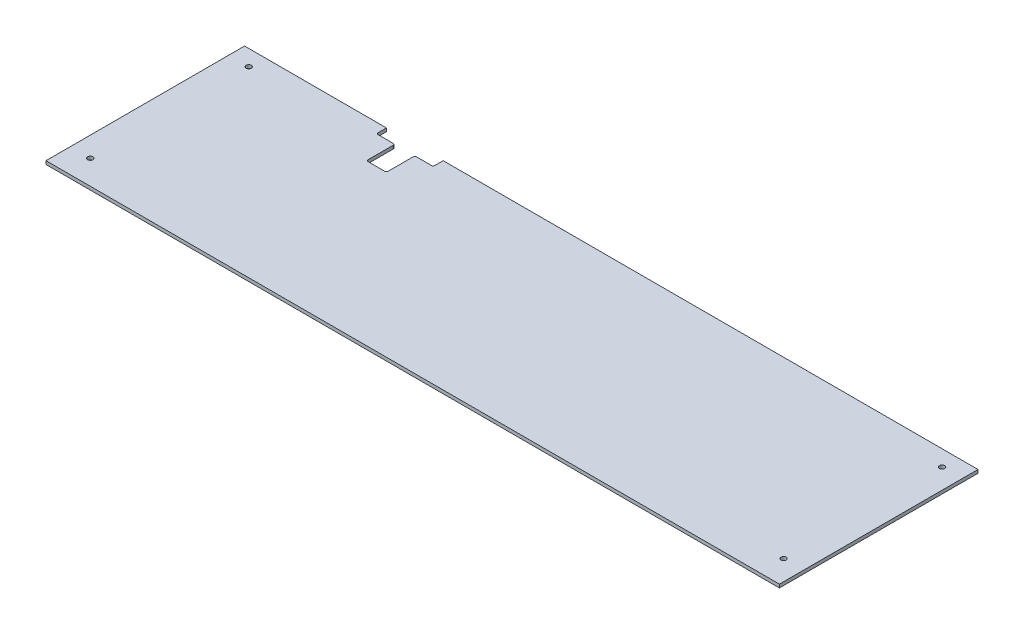
ISO-10303-21;
HEADER;
FILE_DESCRIPTION(('STEP AP214'),'2;1');
FILE_NAME('part.step','',(''),(''),'','','');
FILE_SCHEMA(('AUTOMOTIVE_DESIGN { 1 0 10303 214 1 1 1 1 }'));
ENDSEC;
DATA;
#1=APPLICATION_CONTEXT('core data for automotive mechanical design processes');
#2=APPLICATION_PROTOCOL_DEFINITION('international standard','automotive_design',2000,#1);
#3=PRODUCT_CONTEXT('',#1,'mechanical');
#4=PRODUCT('Part','Part','',(#3));
#5=PRODUCT_RELATED_PRODUCT_CATEGORY('part','',(#4));
#6=PRODUCT_DEFINITION_FORMATION('','',#4);
#7=PRODUCT_DEFINITION_CONTEXT('part definition',#1,'design');
#8=PRODUCT_DEFINITION('design','',#6,#7);
#9=PRODUCT_DEFINITION_SHAPE('','',#8);
#10=(LENGTH_UNIT() NAMED_UNIT(*) SI_UNIT(.MILLI.,.METRE.));
#11=(NAMED_UNIT(*) PLANE_ANGLE_UNIT() SI_UNIT($,.RADIAN.));
#12=(NAMED_UNIT(*) SI_UNIT($,.STERADIAN.) SOLID_ANGLE_UNIT());
#13=UNCERTAINTY_MEASURE_WITH_UNIT(LENGTH_MEASURE(1.E-05),#10,'distance_accuracy_value','');
#14=(GEOMETRIC_REPRESENTATION_CONTEXT(3) GLOBAL_UNCERTAINTY_ASSIGNED_CONTEXT((#13)) GLOBAL_UNIT_ASSIGNED_CONTEXT((#10,
#11,#12)) REPRESENTATION_CONTEXT('',''));
#15=CARTESIAN_POINT('',(0.,0.,0.));
#16=DIRECTION('',(0.,0.,1.));
#17=DIRECTION('',(1.,0.,0.));
#18=AXIS2_PLACEMENT_3D('',#15,#16,#17);
#19=CARTESIAN_POINT('',(0.5,458.552570905038,-119.5));
#20=DIRECTION('',(0.,0.,-1.));
#21=DIRECTION('',(-1.,0.,0.));
#22=AXIS2_PLACEMENT_3D('',#19,#20,#21);
#23=PLANE('',#22);
#24=DIRECTION('',(0.,-1.,0.));
#25=VECTOR('',#24,1.);
#26=CARTESIAN_POINT('',(85.5,43.0487515035476,-119.5));
#27=LINE('',#26,#25);
#28=CARTESIAN_POINT('',(85.5,2.,-119.5));
#29=VERTEX_POINT('',#28);
#30=CARTESIAN_POINT('',(85.5,0.,-119.5));
#31=VERTEX_POINT('',#30);
#32=EDGE_CURVE('E164',#29,#31,#27,.T.);
#33=ORIENTED_EDGE('',*,*,#32,.T.);
#34=DIRECTION('',(1.,0.,0.));
#35=VECTOR('',#34,1.);
#36=CARTESIAN_POINT('',(0.5,0.,-119.5));
#37=LINE('',#36,#35);
#38=CARTESIAN_POINT('',(0.5,0.,-119.5));
#39=VERTEX_POINT('',#38);
#40=EDGE_CURVE('E176',#39,#31,#37,.T.);
#41=ORIENTED_EDGE('',*,*,#40,.F.);
#42=DIRECTION('',(0.,-1.,0.));
#43=VECTOR('',#42,1.);
#44=CARTESIAN_POINT('',(0.5,458.552570905038,-119.5));
#45=LINE('',#44,#43);
#46=CARTESIAN_POINT('',(0.5,2.,-119.5));
#47=VERTEX_POINT('',#46);
#48=EDGE_CURVE('E201',#47,#39,#45,.T.);
#49=ORIENTED_EDGE('',*,*,#48,.F.);
#50=DIRECTION('',(-1.,0.,0.));
#51=VECTOR('',#50,1.);
#52=CARTESIAN_POINT('',(0.5,2.,-119.5));
#53=LINE('',#52,#51);
#54=EDGE_CURVE('E178',#29,#47,#53,.T.);
#55=ORIENTED_EDGE('',*,*,#54,.F.);
#56=EDGE_LOOP('',(#33,#41,#49,#55));
#57=FACE_BOUND('',#56,.T.);
#58=ADVANCED_FACE('F34',(#57),#23,.T.);
#59=CARTESIAN_POINT('',(0.,2.,0.));
#60=DIRECTION('',(0.,-1.,0.));
#61=DIRECTION('',(0.,0.,-1.));
#62=AXIS2_PLACEMENT_3D('',#59,#60,#61);
#63=PLANE('',#62);
#64=CARTESIAN_POINT('',(428.,2.,-110.));
#65=DIRECTION('',(0.,1.,0.));
#66=DIRECTION('',(0.,0.,-1.));
#67=AXIS2_PLACEMENT_3D('',#64,#65,#66);
#68=CIRCLE('',#67,1.54999999999999);
#69=CARTESIAN_POINT('',(428.,2.,-111.55));
#70=VERTEX_POINT('',#69);
#71=EDGE_CURVE('E207',#70,#70,#68,.T.);
#72=ORIENTED_EDGE('',*,*,#71,.F.);
#73=EDGE_LOOP('',(#72));
#74=FACE_BOUND('',#73,.T.);
#75=CARTESIAN_POINT('',(428.,2.,-15.));
#76=DIRECTION('',(0.,1.,0.));
#77=DIRECTION('',(0.,0.,-1.));
#78=AXIS2_PLACEMENT_3D('',#75,#76,#77);
#79=CIRCLE('',#78,1.54999999999999);
#80=CARTESIAN_POINT('',(428.,2.,-16.55));
#81=VERTEX_POINT('',#80);
#82=EDGE_CURVE('E215',#81,#81,#79,.T.);
#83=ORIENTED_EDGE('',*,*,#82,.F.);
#84=EDGE_LOOP('',(#83));
#85=FACE_BOUND('',#84,.T.);
#86=CARTESIAN_POINT('',(12.5,2.,-110.));
#87=DIRECTION('',(0.,1.,0.));
#88=DIRECTION('',(0.,0.,1.));
#89=AXIS2_PLACEMENT_3D('',#86,#87,#88);
#90=CIRCLE('',#89,1.54999999999999);
#91=CARTESIAN_POINT('',(12.5,2.,-108.45));
#92=VERTEX_POINT('',#91);
#93=EDGE_CURVE('E221',#92,#92,#90,.T.);
#94=ORIENTED_EDGE('',*,*,#93,.F.);
#95=EDGE_LOOP('',(#94));
#96=FACE_BOUND('',#95,.T.);
#97=CARTESIAN_POINT('',(12.5,2.,-15.));
#98=DIRECTION('',(0.,1.,0.));
#99=DIRECTION('',(0.,0.,1.));
#100=AXIS2_PLACEMENT_3D('',#97,#98,#99);
#101=CIRCLE('',#100,1.55);
#102=CARTESIAN_POINT('',(12.5,2.,-13.45));
#103=VERTEX_POINT('',#102);
#104=EDGE_CURVE('E227',#103,#103,#101,.T.);
#105=ORIENTED_EDGE('',*,*,#104,.F.);
#106=EDGE_LOOP('',(#105));
#107=FACE_BOUND('',#106,.T.);
#108=DIRECTION('',(1.,0.,0.));
#109=VECTOR('',#108,1.);
#110=CARTESIAN_POINT('',(108.5,2.,-113.5));
#111=LINE('',#110,#109);
#112=CARTESIAN_POINT('',(109.5,2.,-113.5));
#113=VERTEX_POINT('',#112);
#114=CARTESIAN_POINT('',(118.5,2.,-113.5));
#115=VERTEX_POINT('',#114);
#116=EDGE_CURVE('E305',#113,#115,#111,.T.);
#117=ORIENTED_EDGE('',*,*,#116,.F.);
#118=CARTESIAN_POINT('',(109.5,2.,-112.5));
#119=DIRECTION('',(0.,-1.,0.));
#120=DIRECTION('',(0.,0.,-1.));
#121=AXIS2_PLACEMENT_3D('',#118,#119,#120);
#122=CIRCLE('',#121,1.);
#123=CARTESIAN_POINT('',(108.5,2.,-112.5));
#124=VERTEX_POINT('',#123);
#125=EDGE_CURVE('E256',#113,#124,#122,.F.);
#126=ORIENTED_EDGE('',*,*,#125,.T.);
#127=DIRECTION('',(0.,0.,-1.));
#128=VECTOR('',#127,1.);
#129=CARTESIAN_POINT('',(108.5,2.,-113.5));
#130=LINE('',#129,#128);
#131=CARTESIAN_POINT('',(108.5,2.,-97.5));
#132=VERTEX_POINT('',#131);
#133=EDGE_CURVE('E297',#132,#124,#130,.T.);
#134=ORIENTED_EDGE('',*,*,#133,.F.);
#135=CARTESIAN_POINT('',(107.5,2.,-97.5));
#136=DIRECTION('',(0.,-1.,0.));
#137=DIRECTION('',(0.,0.,-1.));
#138=AXIS2_PLACEMENT_3D('',#135,#136,#137);
#139=CIRCLE('',#138,1.);
#140=CARTESIAN_POINT('',(107.5,2.,-96.5));
#141=VERTEX_POINT('',#140);
#142=EDGE_CURVE('E11',#132,#141,#139,.T.);
#143=ORIENTED_EDGE('',*,*,#142,.T.);
#144=DIRECTION('',(1.,0.,0.));
#145=VECTOR('',#144,1.);
#146=CARTESIAN_POINT('',(96.5,2.,-96.5));
#147=LINE('',#146,#145);
#148=CARTESIAN_POINT('',(97.5,2.,-96.5));
#149=VERTEX_POINT('',#148);
#150=EDGE_CURVE('E296',#149,#141,#147,.T.);
#151=ORIENTED_EDGE('',*,*,#150,.F.);
#152=CARTESIAN_POINT('',(97.5,2.,-97.5));
#153=DIRECTION('',(0.,-1.,0.));
#154=DIRECTION('',(0.,0.,-1.));
#155=AXIS2_PLACEMENT_3D('',#152,#153,#154);
#156=CIRCLE('',#155,1.);
#157=CARTESIAN_POINT('',(96.5,2.,-97.5));
#158=VERTEX_POINT('',#157);
#159=EDGE_CURVE('E49',#149,#158,#156,.T.);
#160=ORIENTED_EDGE('',*,*,#159,.T.);
#161=DIRECTION('',(0.,0.,1.));
#162=VECTOR('',#161,1.);
#163=CARTESIAN_POINT('',(96.5,2.,-113.5));
#164=LINE('',#163,#162);
#165=CARTESIAN_POINT('',(96.5,2.,-112.5));
#166=VERTEX_POINT('',#165);
#167=EDGE_CURVE('E301',#166,#158,#164,.T.);
#168=ORIENTED_EDGE('',*,*,#167,.F.);
#169=CARTESIAN_POINT('',(95.5,2.,-112.5));
#170=DIRECTION('',(0.,-1.,0.));
#171=DIRECTION('',(0.,0.,-1.));
#172=AXIS2_PLACEMENT_3D('',#169,#170,#171);
#173=CIRCLE('',#172,1.);
#174=CARTESIAN_POINT('',(95.5,2.,-113.5));
#175=VERTEX_POINT('',#174);
#176=EDGE_CURVE('E254',#166,#175,#173,.F.);
#177=ORIENTED_EDGE('',*,*,#176,.T.);
#178=DIRECTION('',(1.,0.,0.));
#179=VECTOR('',#178,1.);
#180=CARTESIAN_POINT('',(85.5,2.,-113.5));
#181=LINE('',#180,#179);
#182=CARTESIAN_POINT('',(86.5,2.,-113.5));
#183=VERTEX_POINT('',#182);
#184=EDGE_CURVE('E303',#183,#175,#181,.T.);
#185=ORIENTED_EDGE('',*,*,#184,.F.);
#186=CARTESIAN_POINT('',(86.5,2.,-114.5));
#187=DIRECTION('',(0.,-1.,0.));
#188=DIRECTION('',(0.,0.,-1.));
#189=AXIS2_PLACEMENT_3D('',#186,#187,#188);
#190=CIRCLE('',#189,1.);
#191=CARTESIAN_POINT('',(85.5,2.,-114.5));
#192=VERTEX_POINT('',#191);
#193=EDGE_CURVE('E269',#183,#192,#190,.T.);
#194=ORIENTED_EDGE('',*,*,#193,.T.);
#195=DIRECTION('',(0.,0.,1.));
#196=VECTOR('',#195,1.);
#197=CARTESIAN_POINT('',(85.5,2.,-119.5));
#198=LINE('',#197,#196);
#199=EDGE_CURVE('E311',#29,#192,#198,.T.);
#200=ORIENTED_EDGE('',*,*,#199,.F.);
#201=ORIENTED_EDGE('',*,*,#54,.T.);
#202=DIRECTION('',(0.,0.,1.));
#203=VECTOR('',#202,1.);
#204=CARTESIAN_POINT('',(0.5,2.,-0.5));
#205=LINE('',#204,#203);
#206=CARTESIAN_POINT('',(0.5,2.,-0.5));
#207=VERTEX_POINT('',#206);
#208=EDGE_CURVE('E214',#47,#207,#205,.T.);
#209=ORIENTED_EDGE('',*,*,#208,.T.);
#210=DIRECTION('',(1.,0.,0.));
#211=VECTOR('',#210,1.);
#212=CARTESIAN_POINT('',(440.,2.,-0.499999999999996));
#213=LINE('',#212,#211);
#214=CARTESIAN_POINT('',(440.,2.,-0.499999999999996));
#215=VERTEX_POINT('',#214);
#216=EDGE_CURVE('E200',#207,#215,#213,.T.);
#217=ORIENTED_EDGE('',*,*,#216,.T.);
#218=DIRECTION('',(0.,0.,-1.));
#219=VECTOR('',#218,1.);
#220=CARTESIAN_POINT('',(440.,2.,-119.5));
#221=LINE('',#220,#219);
#222=CARTESIAN_POINT('',(440.,2.,-119.5));
#223=VERTEX_POINT('',#222);
#224=EDGE_CURVE('E206',#215,#223,#221,.T.);
#225=ORIENTED_EDGE('',*,*,#224,.T.);
#226=CARTESIAN_POINT('',(119.5,2.,-119.5));
#227=VERTEX_POINT('',#226);
#228=EDGE_CURVE('E327',#223,#227,#53,.T.);
#229=ORIENTED_EDGE('',*,*,#228,.T.);
#230=DIRECTION('',(0.,0.,-1.));
#231=VECTOR('',#230,1.);
#232=CARTESIAN_POINT('',(119.5,2.,-119.5));
#233=LINE('',#232,#231);
#234=CARTESIAN_POINT('',(119.5,2.,-114.5));
#235=VERTEX_POINT('',#234);
#236=EDGE_CURVE('E323',#235,#227,#233,.T.);
#237=ORIENTED_EDGE('',*,*,#236,.F.);
#238=CARTESIAN_POINT('',(118.5,2.,-114.5));
#239=DIRECTION('',(0.,-1.,0.));
#240=DIRECTION('',(0.,0.,-1.));
#241=AXIS2_PLACEMENT_3D('',#238,#239,#240);
#242=CIRCLE('',#241,1.);
#243=EDGE_CURVE('E273',#235,#115,#242,.T.);
#244=ORIENTED_EDGE('',*,*,#243,.T.);
#245=EDGE_LOOP('',(#117,#126,#134,#143,#151,#160,#168,#177,#185,#194,#200,#201,#209,#217,#225,
#229,#237,#244));
#246=FACE_BOUND('',#245,.T.);
#247=ADVANCED_FACE('F295',(#74,#85,#96,#107,#246),#63,.F.);
#248=CARTESIAN_POINT('',(0.,0.,0.));
#249=DIRECTION('',(0.,-1.,0.));
#250=DIRECTION('',(0.,0.,-1.));
#251=AXIS2_PLACEMENT_3D('',#248,#249,#250);
#252=PLANE('',#251);
#253=DIRECTION('',(0.,0.,1.));
#254=VECTOR('',#253,1.);
#255=CARTESIAN_POINT('',(108.5,0.,-113.5));
#256=LINE('',#255,#254);
#257=CARTESIAN_POINT('',(108.5,0.,-112.5));
#258=VERTEX_POINT('',#257);
#259=CARTESIAN_POINT('',(108.5,0.,-97.5));
#260=VERTEX_POINT('',#259);
#261=EDGE_CURVE('E279',#258,#260,#256,.T.);
#262=ORIENTED_EDGE('',*,*,#261,.F.);
#263=CARTESIAN_POINT('',(109.5,0.,-112.5));
#264=DIRECTION('',(0.,-1.,0.));
#265=DIRECTION('',(0.,0.,-1.));
#266=AXIS2_PLACEMENT_3D('',#263,#264,#265);
#267=CIRCLE('',#266,1.);
#268=CARTESIAN_POINT('',(109.5,0.,-113.5));
#269=VERTEX_POINT('',#268);
#270=EDGE_CURVE('E252',#258,#269,#267,.T.);
#271=ORIENTED_EDGE('',*,*,#270,.T.);
#272=DIRECTION('',(-1.,0.,0.));
#273=VECTOR('',#272,1.);
#274=CARTESIAN_POINT('',(108.5,0.,-113.5));
#275=LINE('',#274,#273);
#276=CARTESIAN_POINT('',(118.5,0.,-113.5));
#277=VERTEX_POINT('',#276);
#278=EDGE_CURVE('E290',#277,#269,#275,.T.);
#279=ORIENTED_EDGE('',*,*,#278,.F.);
#280=CARTESIAN_POINT('',(118.5,0.,-114.5));
#281=DIRECTION('',(0.,-1.,0.));
#282=DIRECTION('',(0.,0.,-1.));
#283=AXIS2_PLACEMENT_3D('',#280,#281,#282);
#284=CIRCLE('',#283,1.);
#285=CARTESIAN_POINT('',(119.5,0.,-114.5));
#286=VERTEX_POINT('',#285);
#287=EDGE_CURVE('E271',#277,#286,#284,.F.);
#288=ORIENTED_EDGE('',*,*,#287,.T.);
#289=DIRECTION('',(0.,0.,1.));
#290=VECTOR('',#289,1.);
#291=CARTESIAN_POINT('',(119.5,0.,-119.5));
#292=LINE('',#291,#290);
#293=CARTESIAN_POINT('',(119.5,0.,-119.5));
#294=VERTEX_POINT('',#293);
#295=EDGE_CURVE('E170',#294,#286,#292,.T.);
#296=ORIENTED_EDGE('',*,*,#295,.F.);
#297=CARTESIAN_POINT('',(440.,0.,-119.5));
#298=VERTEX_POINT('',#297);
#299=EDGE_CURVE('E189',#294,#298,#37,.T.);
#300=ORIENTED_EDGE('',*,*,#299,.T.);
#301=DIRECTION('',(0.,0.,1.));
#302=VECTOR('',#301,1.);
#303=CARTESIAN_POINT('',(440.,0.,-119.5));
#304=LINE('',#303,#302);
#305=CARTESIAN_POINT('',(440.,0.,-0.499999999999996));
#306=VERTEX_POINT('',#305);
#307=EDGE_CURVE('E312',#298,#306,#304,.T.);
#308=ORIENTED_EDGE('',*,*,#307,.T.);
#309=DIRECTION('',(-1.,0.,0.));
#310=VECTOR('',#309,1.);
#311=CARTESIAN_POINT('',(440.,0.,-0.499999999999996));
#312=LINE('',#311,#310);
#313=CARTESIAN_POINT('',(0.5,0.,-0.5));
#314=VERTEX_POINT('',#313);
#315=EDGE_CURVE('E333',#306,#314,#312,.T.);
#316=ORIENTED_EDGE('',*,*,#315,.T.);
#317=DIRECTION('',(0.,0.,-1.));
#318=VECTOR('',#317,1.);
#319=CARTESIAN_POINT('',(0.5,0.,-0.5));
#320=LINE('',#319,#318);
#321=EDGE_CURVE('E187',#314,#39,#320,.T.);
#322=ORIENTED_EDGE('',*,*,#321,.T.);
#323=ORIENTED_EDGE('',*,*,#40,.T.);
#324=DIRECTION('',(0.,0.,-1.));
#325=VECTOR('',#324,1.);
#326=CARTESIAN_POINT('',(85.5,0.,-119.5));
#327=LINE('',#326,#325);
#328=CARTESIAN_POINT('',(85.5,0.,-114.5));
#329=VERTEX_POINT('',#328);
#330=EDGE_CURVE('E160',#329,#31,#327,.T.);
#331=ORIENTED_EDGE('',*,*,#330,.F.);
#332=CARTESIAN_POINT('',(86.5,0.,-114.5));
#333=DIRECTION('',(0.,-1.,0.));
#334=DIRECTION('',(0.,0.,-1.));
#335=AXIS2_PLACEMENT_3D('',#332,#333,#334);
#336=CIRCLE('',#335,1.);
#337=CARTESIAN_POINT('',(86.5,0.,-113.5));
#338=VERTEX_POINT('',#337);
#339=EDGE_CURVE('E267',#329,#338,#336,.F.);
#340=ORIENTED_EDGE('',*,*,#339,.T.);
#341=DIRECTION('',(-1.,0.,0.));
#342=VECTOR('',#341,1.);
#343=CARTESIAN_POINT('',(85.5,0.,-113.5));
#344=LINE('',#343,#342);
#345=CARTESIAN_POINT('',(95.5,0.,-113.5));
#346=VERTEX_POINT('',#345);
#347=EDGE_CURVE('E180',#346,#338,#344,.T.);
#348=ORIENTED_EDGE('',*,*,#347,.F.);
#349=CARTESIAN_POINT('',(95.5,0.,-112.5));
#350=DIRECTION('',(0.,-1.,0.));
#351=DIRECTION('',(0.,0.,-1.));
#352=AXIS2_PLACEMENT_3D('',#349,#350,#351);
#353=CIRCLE('',#352,1.);
#354=CARTESIAN_POINT('',(96.5,0.,-112.5));
#355=VERTEX_POINT('',#354);
#356=EDGE_CURVE('E250',#346,#355,#353,.T.);
#357=ORIENTED_EDGE('',*,*,#356,.T.);
#358=DIRECTION('',(0.,0.,-1.));
#359=VECTOR('',#358,1.);
#360=CARTESIAN_POINT('',(96.5,0.,-113.5));
#361=LINE('',#360,#359);
#362=CARTESIAN_POINT('',(96.5,0.,-97.5));
#363=VERTEX_POINT('',#362);
#364=EDGE_CURVE('E319',#363,#355,#361,.T.);
#365=ORIENTED_EDGE('',*,*,#364,.F.);
#366=CARTESIAN_POINT('',(97.5,0.,-97.5));
#367=DIRECTION('',(0.,-1.,0.));
#368=DIRECTION('',(0.,0.,-1.));
#369=AXIS2_PLACEMENT_3D('',#366,#367,#368);
#370=CIRCLE('',#369,1.);
#371=CARTESIAN_POINT('',(97.5,0.,-96.5));
#372=VERTEX_POINT('',#371);
#373=EDGE_CURVE('E275',#363,#372,#370,.F.);
#374=ORIENTED_EDGE('',*,*,#373,.T.);
#375=DIRECTION('',(-1.,0.,0.));
#376=VECTOR('',#375,1.);
#377=CARTESIAN_POINT('',(96.5,0.,-96.5));
#378=LINE('',#377,#376);
#379=CARTESIAN_POINT('',(107.5,0.,-96.5));
#380=VERTEX_POINT('',#379);
#381=EDGE_CURVE('E281',#380,#372,#378,.T.);
#382=ORIENTED_EDGE('',*,*,#381,.F.);
#383=CARTESIAN_POINT('',(107.5,0.,-97.5));
#384=DIRECTION('',(0.,-1.,0.));
#385=DIRECTION('',(0.,0.,-1.));
#386=AXIS2_PLACEMENT_3D('',#383,#384,#385);
#387=CIRCLE('',#386,1.);
#388=EDGE_CURVE('E42',#380,#260,#387,.F.);
#389=ORIENTED_EDGE('',*,*,#388,.T.);
#390=EDGE_LOOP('',(#262,#271,#279,#288,#296,#300,#308,#316,#322,#323,#331,#340,#348,#357,#365,
#374,#382,#389));
#391=FACE_BOUND('',#390,.T.);
#392=CARTESIAN_POINT('',(428.,0.,-110.));
#393=DIRECTION('',(0.,1.,0.));
#394=DIRECTION('',(0.,0.,-1.));
#395=AXIS2_PLACEMENT_3D('',#392,#393,#394);
#396=CIRCLE('',#395,1.54999999999999);
#397=CARTESIAN_POINT('',(428.,0.,-111.55));
#398=VERTEX_POINT('',#397);
#399=EDGE_CURVE('E211',#398,#398,#396,.T.);
#400=ORIENTED_EDGE('',*,*,#399,.T.);
#401=EDGE_LOOP('',(#400));
#402=FACE_BOUND('',#401,.T.);
#403=CARTESIAN_POINT('',(12.5,0.,-110.));
#404=DIRECTION('',(0.,1.,0.));
#405=DIRECTION('',(0.,0.,1.));
#406=AXIS2_PLACEMENT_3D('',#403,#404,#405);
#407=CIRCLE('',#406,1.54999999999999);
#408=CARTESIAN_POINT('',(12.5,0.,-108.45));
#409=VERTEX_POINT('',#408);
#410=EDGE_CURVE('E218',#409,#409,#407,.T.);
#411=ORIENTED_EDGE('',*,*,#410,.T.);
#412=EDGE_LOOP('',(#411));
#413=FACE_BOUND('',#412,.T.);
#414=CARTESIAN_POINT('',(12.5,0.,-15.));
#415=DIRECTION('',(0.,1.,0.));
#416=DIRECTION('',(0.,0.,1.));
#417=AXIS2_PLACEMENT_3D('',#414,#415,#416);
#418=CIRCLE('',#417,1.55);
#419=CARTESIAN_POINT('',(12.5,0.,-13.45));
#420=VERTEX_POINT('',#419);
#421=EDGE_CURVE('E224',#420,#420,#418,.T.);
#422=ORIENTED_EDGE('',*,*,#421,.T.);
#423=EDGE_LOOP('',(#422));
#424=FACE_BOUND('',#423,.T.);
#425=CARTESIAN_POINT('',(428.,0.,-15.));
#426=DIRECTION('',(0.,1.,0.));
#427=DIRECTION('',(0.,0.,-1.));
#428=AXIS2_PLACEMENT_3D('',#425,#426,#427);
#429=CIRCLE('',#428,1.54999999999999);
#430=CARTESIAN_POINT('',(428.,0.,-16.55));
#431=VERTEX_POINT('',#430);
#432=EDGE_CURVE('E210',#431,#431,#429,.T.);
#433=ORIENTED_EDGE('',*,*,#432,.T.);
#434=EDGE_LOOP('',(#433));
#435=FACE_BOUND('',#434,.T.);
#436=ADVANCED_FACE('F183',(#391,#402,#413,#424,#435),#252,.T.);
#437=CARTESIAN_POINT('',(12.5,2.,-15.));
#438=DIRECTION('',(0.,-1.,0.));
#439=DIRECTION('',(0.,0.,-1.));
#440=AXIS2_PLACEMENT_3D('',#437,#438,#439);
#441=CYLINDRICAL_SURFACE('',#440,1.55);
#442=ORIENTED_EDGE('',*,*,#104,.T.);
#443=EDGE_LOOP('',(#442));
#444=FACE_BOUND('',#443,.T.);
#445=ORIENTED_EDGE('',*,*,#421,.F.);
#446=EDGE_LOOP('',(#445));
#447=FACE_BOUND('',#446,.T.);
#448=ADVANCED_FACE('F420',(#444,#447),#441,.F.);
#449=CARTESIAN_POINT('',(12.5,2.,-110.));
#450=DIRECTION('',(0.,-1.,0.));
#451=DIRECTION('',(0.,0.,-1.));
#452=AXIS2_PLACEMENT_3D('',#449,#450,#451);
#453=CYLINDRICAL_SURFACE('',#452,1.54999999999999);
#454=ORIENTED_EDGE('',*,*,#93,.T.);
#455=EDGE_LOOP('',(#454));
#456=FACE_BOUND('',#455,.T.);
#457=ORIENTED_EDGE('',*,*,#410,.F.);
#458=EDGE_LOOP('',(#457));
#459=FACE_BOUND('',#458,.T.);
#460=ADVANCED_FACE('F424',(#456,#459),#453,.F.);
#461=CARTESIAN_POINT('',(428.,2.,-15.));
#462=DIRECTION('',(0.,-1.,0.));
#463=DIRECTION('',(0.,0.,-1.));
#464=AXIS2_PLACEMENT_3D('',#461,#462,#463);
#465=CYLINDRICAL_SURFACE('',#464,1.54999999999999);
#466=ORIENTED_EDGE('',*,*,#82,.T.);
#467=EDGE_LOOP('',(#466));
#468=FACE_BOUND('',#467,.T.);
#469=ORIENTED_EDGE('',*,*,#432,.F.);
#470=EDGE_LOOP('',(#469));
#471=FACE_BOUND('',#470,.T.);
#472=ADVANCED_FACE('F428',(#468,#471),#465,.F.);
#473=CARTESIAN_POINT('',(428.,2.,-110.));
#474=DIRECTION('',(0.,-1.,0.));
#475=DIRECTION('',(0.,0.,-1.));
#476=AXIS2_PLACEMENT_3D('',#473,#474,#475);
#477=CYLINDRICAL_SURFACE('',#476,1.54999999999999);
#478=ORIENTED_EDGE('',*,*,#71,.T.);
#479=EDGE_LOOP('',(#478));
#480=FACE_BOUND('',#479,.T.);
#481=ORIENTED_EDGE('',*,*,#399,.F.);
#482=EDGE_LOOP('',(#481));
#483=FACE_BOUND('',#482,.T.);
#484=ADVANCED_FACE('F356',(#480,#483),#477,.F.);
#485=CARTESIAN_POINT('',(440.,458.552570905038,-0.499999999999996));
#486=DIRECTION('',(0.,0.,1.));
#487=DIRECTION('',(1.,0.,0.));
#488=AXIS2_PLACEMENT_3D('',#485,#486,#487);
#489=PLANE('',#488);
#490=DIRECTION('',(0.,-1.,0.));
#491=VECTOR('',#490,1.);
#492=CARTESIAN_POINT('',(0.5,458.552570905038,-0.5));
#493=LINE('',#492,#491);
#494=EDGE_CURVE('E192',#207,#314,#493,.T.);
#495=ORIENTED_EDGE('',*,*,#494,.T.);
#496=ORIENTED_EDGE('',*,*,#315,.F.);
#497=DIRECTION('',(0.,-1.,0.));
#498=VECTOR('',#497,1.);
#499=CARTESIAN_POINT('',(440.,458.552570905038,-0.499999999999996));
#500=LINE('',#499,#498);
#501=EDGE_CURVE('E188',#215,#306,#500,.T.);
#502=ORIENTED_EDGE('',*,*,#501,.F.);
#503=ORIENTED_EDGE('',*,*,#216,.F.);
#504=EDGE_LOOP('',(#495,#496,#502,#503));
#505=FACE_BOUND('',#504,.T.);
#506=ADVANCED_FACE('F337',(#505),#489,.T.);
#507=CARTESIAN_POINT('',(0.5,458.552570905038,-0.5));
#508=DIRECTION('',(-1.,0.,0.));
#509=DIRECTION('',(0.,0.,1.));
#510=AXIS2_PLACEMENT_3D('',#507,#508,#509);
#511=PLANE('',#510);
#512=ORIENTED_EDGE('',*,*,#48,.T.);
#513=ORIENTED_EDGE('',*,*,#321,.F.);
#514=ORIENTED_EDGE('',*,*,#494,.F.);
#515=ORIENTED_EDGE('',*,*,#208,.F.);
#516=EDGE_LOOP('',(#512,#513,#514,#515));
#517=FACE_BOUND('',#516,.T.);
#518=ADVANCED_FACE('F345',(#517),#511,.T.);
#519=DIRECTION('',(0.,-1.,0.));
#520=VECTOR('',#519,1.);
#521=CARTESIAN_POINT('',(119.5,43.0487515035476,-119.5));
#522=LINE('',#521,#520);
#523=EDGE_CURVE('E179',#227,#294,#522,.T.);
#524=ORIENTED_EDGE('',*,*,#523,.F.);
#525=ORIENTED_EDGE('',*,*,#228,.F.);
#526=DIRECTION('',(0.,-1.,0.));
#527=VECTOR('',#526,1.);
#528=CARTESIAN_POINT('',(440.,458.552570905038,-119.5));
#529=LINE('',#528,#527);
#530=EDGE_CURVE('E197',#223,#298,#529,.T.);
#531=ORIENTED_EDGE('',*,*,#530,.T.);
#532=ORIENTED_EDGE('',*,*,#299,.F.);
#533=EDGE_LOOP('',(#524,#525,#531,#532));
#534=FACE_BOUND('',#533,.T.);
#535=ADVANCED_FACE('F347',(#534),#23,.T.);
#536=CARTESIAN_POINT('',(440.,458.552570905038,-119.5));
#537=DIRECTION('',(1.,0.,0.));
#538=DIRECTION('',(0.,0.,-1.));
#539=AXIS2_PLACEMENT_3D('',#536,#537,#538);
#540=PLANE('',#539);
#541=ORIENTED_EDGE('',*,*,#501,.T.);
#542=ORIENTED_EDGE('',*,*,#307,.F.);
#543=ORIENTED_EDGE('',*,*,#530,.F.);
#544=ORIENTED_EDGE('',*,*,#224,.F.);
#545=EDGE_LOOP('',(#541,#542,#543,#544));
#546=FACE_BOUND('',#545,.T.);
#547=ADVANCED_FACE('F340',(#546),#540,.T.);
#548=CARTESIAN_POINT('',(85.5,43.0487515035476,-119.5));
#549=DIRECTION('',(-1.,0.,0.));
#550=DIRECTION('',(0.,0.,1.));
#551=AXIS2_PLACEMENT_3D('',#548,#549,#550);
#552=PLANE('',#551);
#553=ORIENTED_EDGE('',*,*,#199,.T.);
#554=DIRECTION('',(0.,-1.,0.));
#555=VECTOR('',#554,1.);
#556=CARTESIAN_POINT('',(85.5,0.,-114.5));
#557=LINE('',#556,#555);
#558=EDGE_CURVE('E167',#192,#329,#557,.T.);
#559=ORIENTED_EDGE('',*,*,#558,.T.);
#560=ORIENTED_EDGE('',*,*,#330,.T.);
#561=ORIENTED_EDGE('',*,*,#32,.F.);
#562=EDGE_LOOP('',(#553,#559,#560,#561));
#563=FACE_BOUND('',#562,.T.);
#564=ADVANCED_FACE('F163',(#563),#552,.F.);
#565=CARTESIAN_POINT('',(85.5,43.0487515035476,-113.5));
#566=DIRECTION('',(0.,0.,1.));
#567=DIRECTION('',(1.,0.,0.));
#568=AXIS2_PLACEMENT_3D('',#565,#566,#567);
#569=PLANE('',#568);
#570=ORIENTED_EDGE('',*,*,#347,.T.);
#571=DIRECTION('',(0.,-1.,0.));
#572=VECTOR('',#571,1.);
#573=CARTESIAN_POINT('',(86.5,2.,-113.5));
#574=LINE('',#573,#572);
#575=EDGE_CURVE('E236',#338,#183,#574,.F.);
#576=ORIENTED_EDGE('',*,*,#575,.T.);
#577=ORIENTED_EDGE('',*,*,#184,.T.);
#578=DIRECTION('',(0.,-1.,0.));
#579=VECTOR('',#578,1.);
#580=CARTESIAN_POINT('',(95.5,43.0487515035476,-113.5));
#581=LINE('',#580,#579);
#582=EDGE_CURVE('E233',#175,#346,#581,.T.);
#583=ORIENTED_EDGE('',*,*,#582,.T.);
#584=EDGE_LOOP('',(#570,#576,#577,#583));
#585=FACE_BOUND('',#584,.T.);
#586=ADVANCED_FACE('F368',(#585),#569,.F.);
#587=CARTESIAN_POINT('',(96.5,43.0487515035476,-113.5));
#588=DIRECTION('',(-1.,0.,0.));
#589=DIRECTION('',(0.,0.,1.));
#590=AXIS2_PLACEMENT_3D('',#587,#588,#589);
#591=PLANE('',#590);
#592=ORIENTED_EDGE('',*,*,#364,.T.);
#593=DIRECTION('',(0.,-1.,0.));
#594=VECTOR('',#593,1.);
#595=CARTESIAN_POINT('',(96.5,43.0487515035476,-112.5));
#596=LINE('',#595,#594);
#597=EDGE_CURVE('E56',#355,#166,#596,.F.);
#598=ORIENTED_EDGE('',*,*,#597,.T.);
#599=ORIENTED_EDGE('',*,*,#167,.T.);
#600=DIRECTION('',(0.,-1.,0.));
#601=VECTOR('',#600,1.);
#602=CARTESIAN_POINT('',(96.5,0.,-97.5));
#603=LINE('',#602,#601);
#604=EDGE_CURVE('E258',#158,#363,#603,.T.);
#605=ORIENTED_EDGE('',*,*,#604,.T.);
#606=EDGE_LOOP('',(#592,#598,#599,#605));
#607=FACE_BOUND('',#606,.T.);
#608=ADVANCED_FACE('F382',(#607),#591,.F.);
#609=CARTESIAN_POINT('',(96.5,43.0487515035476,-96.5));
#610=DIRECTION('',(0.,0.,1.));
#611=DIRECTION('',(1.,0.,0.));
#612=AXIS2_PLACEMENT_3D('',#609,#610,#611);
#613=PLANE('',#612);
#614=ORIENTED_EDGE('',*,*,#381,.T.);
#615=DIRECTION('',(0.,-1.,0.));
#616=VECTOR('',#615,1.);
#617=CARTESIAN_POINT('',(97.5,2.,-96.5));
#618=LINE('',#617,#616);
#619=EDGE_CURVE('E265',#372,#149,#618,.F.);
#620=ORIENTED_EDGE('',*,*,#619,.T.);
#621=ORIENTED_EDGE('',*,*,#150,.T.);
#622=DIRECTION('',(0.,-1.,0.));
#623=VECTOR('',#622,1.);
#624=CARTESIAN_POINT('',(107.5,0.,-96.5));
#625=LINE('',#624,#623);
#626=EDGE_CURVE('E262',#141,#380,#625,.T.);
#627=ORIENTED_EDGE('',*,*,#626,.T.);
#628=EDGE_LOOP('',(#614,#620,#621,#627));
#629=FACE_BOUND('',#628,.T.);
#630=ADVANCED_FACE('F299',(#629),#613,.F.);
#631=CARTESIAN_POINT('',(108.5,43.0487515035476,-113.5));
#632=DIRECTION('',(1.,0.,0.));
#633=DIRECTION('',(0.,0.,-1.));
#634=AXIS2_PLACEMENT_3D('',#631,#632,#633);
#635=PLANE('',#634);
#636=ORIENTED_EDGE('',*,*,#133,.T.);
#637=DIRECTION('',(0.,-1.,0.));
#638=VECTOR('',#637,1.);
#639=CARTESIAN_POINT('',(108.5,43.0487515035476,-112.5));
#640=LINE('',#639,#638);
#641=EDGE_CURVE('E247',#124,#258,#640,.T.);
#642=ORIENTED_EDGE('',*,*,#641,.T.);
#643=ORIENTED_EDGE('',*,*,#261,.T.);
#644=DIRECTION('',(0.,-1.,0.));
#645=VECTOR('',#644,1.);
#646=CARTESIAN_POINT('',(108.5,2.,-97.5));
#647=LINE('',#646,#645);
#648=EDGE_CURVE('E245',#260,#132,#647,.F.);
#649=ORIENTED_EDGE('',*,*,#648,.T.);
#650=EDGE_LOOP('',(#636,#642,#643,#649));
#651=FACE_BOUND('',#650,.T.);
#652=ADVANCED_FACE('F287',(#651),#635,.F.);
#653=CARTESIAN_POINT('',(108.5,43.0487515035476,-113.5));
#654=DIRECTION('',(0.,0.,1.));
#655=DIRECTION('',(1.,0.,0.));
#656=AXIS2_PLACEMENT_3D('',#653,#654,#655);
#657=PLANE('',#656);
#658=ORIENTED_EDGE('',*,*,#116,.T.);
#659=DIRECTION('',(0.,-1.,0.));
#660=VECTOR('',#659,1.);
#661=CARTESIAN_POINT('',(118.5,0.,-113.5));
#662=LINE('',#661,#660);
#663=EDGE_CURVE('E240',#115,#277,#662,.T.);
#664=ORIENTED_EDGE('',*,*,#663,.T.);
#665=ORIENTED_EDGE('',*,*,#278,.T.);
#666=DIRECTION('',(0.,-1.,0.));
#667=VECTOR('',#666,1.);
#668=CARTESIAN_POINT('',(109.5,43.0487515035476,-113.5));
#669=LINE('',#668,#667);
#670=EDGE_CURVE('E238',#269,#113,#669,.F.);
#671=ORIENTED_EDGE('',*,*,#670,.T.);
#672=EDGE_LOOP('',(#658,#664,#665,#671));
#673=FACE_BOUND('',#672,.T.);
#674=ADVANCED_FACE('F373',(#673),#657,.F.);
#675=CARTESIAN_POINT('',(119.5,43.0487515035476,-119.5));
#676=DIRECTION('',(1.,0.,0.));
#677=DIRECTION('',(0.,0.,-1.));
#678=AXIS2_PLACEMENT_3D('',#675,#676,#677);
#679=PLANE('',#678);
#680=ORIENTED_EDGE('',*,*,#295,.T.);
#681=DIRECTION('',(0.,-1.,0.));
#682=VECTOR('',#681,1.);
#683=CARTESIAN_POINT('',(119.5,2.,-114.5));
#684=LINE('',#683,#682);
#685=EDGE_CURVE('E243',#286,#235,#684,.F.);
#686=ORIENTED_EDGE('',*,*,#685,.T.);
#687=ORIENTED_EDGE('',*,*,#236,.T.);
#688=ORIENTED_EDGE('',*,*,#523,.T.);
#689=EDGE_LOOP('',(#680,#686,#687,#688));
#690=FACE_BOUND('',#689,.T.);
#691=ADVANCED_FACE('F369',(#690),#679,.F.);
#692=CARTESIAN_POINT('',(86.5,43.0487515035476,-114.5));
#693=DIRECTION('',(0.,1.,0.));
#694=DIRECTION('',(0.,0.,1.));
#695=AXIS2_PLACEMENT_3D('',#692,#693,#694);
#696=CYLINDRICAL_SURFACE('',#695,1.);
#697=ORIENTED_EDGE('',*,*,#193,.F.);
#698=ORIENTED_EDGE('',*,*,#575,.F.);
#699=ORIENTED_EDGE('',*,*,#339,.F.);
#700=ORIENTED_EDGE('',*,*,#558,.F.);
#701=EDGE_LOOP('',(#697,#698,#699,#700));
#702=FACE_BOUND('',#701,.T.);
#703=ADVANCED_FACE('F372',(#702),#696,.F.);
#704=CARTESIAN_POINT('',(118.5,43.0487515035476,-114.5));
#705=DIRECTION('',(0.,1.,0.));
#706=DIRECTION('',(0.,0.,1.));
#707=AXIS2_PLACEMENT_3D('',#704,#705,#706);
#708=CYLINDRICAL_SURFACE('',#707,1.);
#709=ORIENTED_EDGE('',*,*,#243,.F.);
#710=ORIENTED_EDGE('',*,*,#685,.F.);
#711=ORIENTED_EDGE('',*,*,#287,.F.);
#712=ORIENTED_EDGE('',*,*,#663,.F.);
#713=EDGE_LOOP('',(#709,#710,#711,#712));
#714=FACE_BOUND('',#713,.T.);
#715=ADVANCED_FACE('F412',(#714),#708,.F.);
#716=CARTESIAN_POINT('',(109.5,43.0487515035476,-112.5));
#717=DIRECTION('',(0.,-1.,0.));
#718=DIRECTION('',(0.,0.,-1.));
#719=AXIS2_PLACEMENT_3D('',#716,#717,#718);
#720=CYLINDRICAL_SURFACE('',#719,1.);
#721=ORIENTED_EDGE('',*,*,#125,.F.);
#722=ORIENTED_EDGE('',*,*,#670,.F.);
#723=ORIENTED_EDGE('',*,*,#270,.F.);
#724=ORIENTED_EDGE('',*,*,#641,.F.);
#725=EDGE_LOOP('',(#721,#722,#723,#724));
#726=FACE_BOUND('',#725,.T.);
#727=ADVANCED_FACE('F407',(#726),#720,.T.);
#728=CARTESIAN_POINT('',(95.5,43.0487515035476,-112.5));
#729=DIRECTION('',(0.,-1.,0.));
#730=DIRECTION('',(0.,0.,-1.));
#731=AXIS2_PLACEMENT_3D('',#728,#729,#730);
#732=CYLINDRICAL_SURFACE('',#731,1.);
#733=ORIENTED_EDGE('',*,*,#176,.F.);
#734=ORIENTED_EDGE('',*,*,#597,.F.);
#735=ORIENTED_EDGE('',*,*,#356,.F.);
#736=ORIENTED_EDGE('',*,*,#582,.F.);
#737=EDGE_LOOP('',(#733,#734,#735,#736));
#738=FACE_BOUND('',#737,.T.);
#739=ADVANCED_FACE('F397',(#738),#732,.T.);
#740=CARTESIAN_POINT('',(97.5,43.0487515035476,-97.5));
#741=DIRECTION('',(0.,1.,0.));
#742=DIRECTION('',(0.,0.,1.));
#743=AXIS2_PLACEMENT_3D('',#740,#741,#742);
#744=CYLINDRICAL_SURFACE('',#743,1.);
#745=ORIENTED_EDGE('',*,*,#159,.F.);
#746=ORIENTED_EDGE('',*,*,#619,.F.);
#747=ORIENTED_EDGE('',*,*,#373,.F.);
#748=ORIENTED_EDGE('',*,*,#604,.F.);
#749=EDGE_LOOP('',(#745,#746,#747,#748));
#750=FACE_BOUND('',#749,.T.);
#751=ADVANCED_FACE('F401',(#750),#744,.F.);
#752=CARTESIAN_POINT('',(107.5,43.0487515035476,-97.5));
#753=DIRECTION('',(0.,1.,0.));
#754=DIRECTION('',(0.,0.,1.));
#755=AXIS2_PLACEMENT_3D('',#752,#753,#754);
#756=CYLINDRICAL_SURFACE('',#755,1.);
#757=ORIENTED_EDGE('',*,*,#142,.F.);
#758=ORIENTED_EDGE('',*,*,#648,.F.);
#759=ORIENTED_EDGE('',*,*,#388,.F.);
#760=ORIENTED_EDGE('',*,*,#626,.F.);
#761=EDGE_LOOP('',(#757,#758,#759,#760));
#762=FACE_BOUND('',#761,.T.);
#763=ADVANCED_FACE('F36',(#762),#756,.F.);
#764=CLOSED_SHELL('',(#58,#247,#436,#448,#460,#472,#484,#506,#518,#535,#547,#564,#586,#608,#630,
#652,#674,#691,#703,#715,#727,#739,#751,#763));
#765=MANIFOLD_SOLID_BREP('B2',#764);
#766=ADVANCED_BREP_SHAPE_REPRESENTATION('',(#18,#765),#14);
#767=SHAPE_DEFINITION_REPRESENTATION(#9,#766);
ENDSEC;
END-ISO-10303-21;
